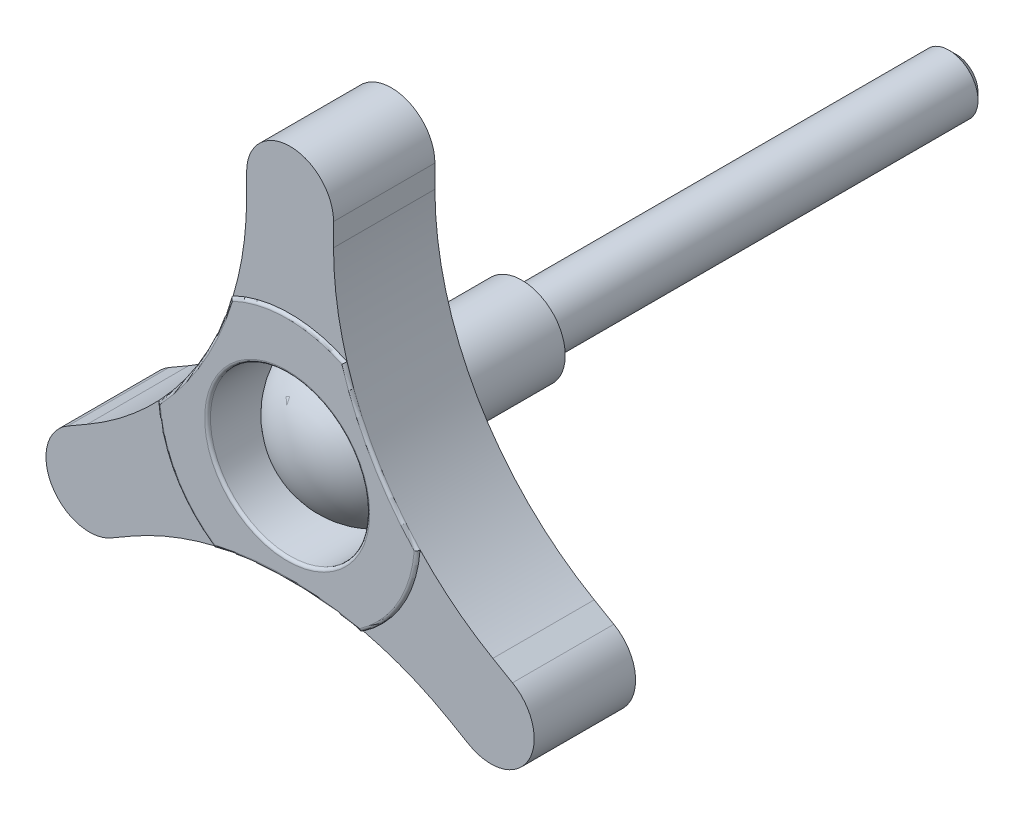
ISO-10303-21;
HEADER;
FILE_DESCRIPTION(('STEP AP214'),'2;1');
FILE_NAME('part.step','',(''),(''),'','','');
FILE_SCHEMA(('AUTOMOTIVE_DESIGN { 1 0 10303 214 1 1 1 1 }'));
ENDSEC;
DATA;
#1=APPLICATION_CONTEXT('core data for automotive mechanical design processes');
#2=APPLICATION_PROTOCOL_DEFINITION('international standard','automotive_design',2000,#1);
#3=PRODUCT_CONTEXT('',#1,'mechanical');
#4=PRODUCT('Part','Part','',(#3));
#5=PRODUCT_RELATED_PRODUCT_CATEGORY('part','',(#4));
#6=PRODUCT_DEFINITION_FORMATION('','',#4);
#7=PRODUCT_DEFINITION_CONTEXT('part definition',#1,'design');
#8=PRODUCT_DEFINITION('design','',#6,#7);
#9=PRODUCT_DEFINITION_SHAPE('','',#8);
#10=(LENGTH_UNIT() NAMED_UNIT(*) SI_UNIT(.MILLI.,.METRE.));
#11=(NAMED_UNIT(*) PLANE_ANGLE_UNIT() SI_UNIT($,.RADIAN.));
#12=(NAMED_UNIT(*) SI_UNIT($,.STERADIAN.) SOLID_ANGLE_UNIT());
#13=UNCERTAINTY_MEASURE_WITH_UNIT(LENGTH_MEASURE(1.E-05),#10,'distance_accuracy_value','');
#14=(GEOMETRIC_REPRESENTATION_CONTEXT(3) GLOBAL_UNCERTAINTY_ASSIGNED_CONTEXT((#13)) GLOBAL_UNIT_ASSIGNED_CONTEXT((#10,
#11,#12)) REPRESENTATION_CONTEXT('',''));
#15=CARTESIAN_POINT('',(0.,0.,0.));
#16=DIRECTION('',(0.,0.,1.));
#17=DIRECTION('',(1.,0.,0.));
#18=AXIS2_PLACEMENT_3D('',#15,#16,#17);
#19=CARTESIAN_POINT('',(-25.,14.4337567297406,7.));
#20=DIRECTION('',(0.,0.,-1.));
#21=DIRECTION('',(0.,1.,0.));
#22=AXIS2_PLACEMENT_3D('',#19,#20,#21);
#23=CYLINDRICAL_SURFACE('',#22,22.);
#24=CARTESIAN_POINT('',(-25.,14.4337567297406,7.00000000000001));
#25=DIRECTION('',(0.,0.,1.));
#26=DIRECTION('',(-1.,0.,0.));
#27=AXIS2_PLACEMENT_3D('',#24,#25,#26);
#28=CIRCLE('',#27,22.);
#29=CARTESIAN_POINT('',(-14.,-4.618802153517,7.00000000000001));
#30=VERTEX_POINT('',#29);
#31=CARTESIAN_POINT('',(-8.97710064562592,-0.641610472407324,7.));
#32=VERTEX_POINT('',#31);
#33=EDGE_CURVE('P0_E680',#30,#32,#28,.T.);
#34=ORIENTED_EDGE('',*,*,#33,.T.);
#35=CARTESIAN_POINT('',(-25.,14.4337567297406,7.));
#36=DIRECTION('',(0.,0.,1.));
#37=DIRECTION('',(1.,0.,0.));
#38=AXIS2_PLACEMENT_3D('',#35,#36,#37);
#39=CIRCLE('',#38,22.);
#40=CARTESIAN_POINT('',(-3.93289935437409,8.09520244764539,7.));
#41=VERTEX_POINT('',#40);
#42=EDGE_CURVE('P0_E701',#32,#41,#39,.T.);
#43=ORIENTED_EDGE('',*,*,#42,.T.);
#44=CARTESIAN_POINT('',(-3.,14.4337567297406,7.00000000000001));
#45=VERTEX_POINT('',#44);
#46=EDGE_CURVE('P0_E213',#41,#45,#28,.T.);
#47=ORIENTED_EDGE('',*,*,#46,.T.);
#48=DIRECTION('',(0.,0.,1.));
#49=VECTOR('',#48,1.);
#50=CARTESIAN_POINT('',(-3.,14.4337567297406,0.));
#51=LINE('',#50,#49);
#52=CARTESIAN_POINT('',(-3.,14.4337567297406,0.));
#53=VERTEX_POINT('',#52);
#54=EDGE_CURVE('P0_E193',#53,#45,#51,.T.);
#55=ORIENTED_EDGE('',*,*,#54,.F.);
#56=CARTESIAN_POINT('',(-25.,14.4337567297406,0.));
#57=DIRECTION('',(0.,0.,1.));
#58=DIRECTION('',(-1.,0.,0.));
#59=AXIS2_PLACEMENT_3D('',#56,#57,#58);
#60=CIRCLE('',#59,22.);
#61=CARTESIAN_POINT('',(-14.,-4.618802153517,0.));
#62=VERTEX_POINT('',#61);
#63=EDGE_CURVE('P0_E199',#62,#53,#60,.T.);
#64=ORIENTED_EDGE('',*,*,#63,.F.);
#65=DIRECTION('',(0.,0.,1.));
#66=VECTOR('',#65,1.);
#67=CARTESIAN_POINT('',(-14.,-4.618802153517,0.));
#68=LINE('',#67,#66);
#69=EDGE_CURVE('P0_E404',#62,#30,#68,.T.);
#70=ORIENTED_EDGE('',*,*,#69,.T.);
#71=EDGE_LOOP('',(#34,#43,#47,#55,#64,#70));
#72=FACE_BOUND('',#71,.T.);
#73=ADVANCED_FACE('P0_F63',(#72),#23,.F.);
#74=CARTESIAN_POINT('',(0.,-28.8675134594813,7.));
#75=DIRECTION('',(0.,0.,-1.));
#76=DIRECTION('',(0.,1.,0.));
#77=AXIS2_PLACEMENT_3D('',#74,#75,#76);
#78=CYLINDRICAL_SURFACE('',#77,22.);
#79=CARTESIAN_POINT('',(0.,-28.8675134594813,7.00000000000001));
#80=DIRECTION('',(0.,0.,1.));
#81=DIRECTION('',(-1.,0.,0.));
#82=AXIS2_PLACEMENT_3D('',#79,#80,#81);
#83=CIRCLE('',#82,22.);
#84=CARTESIAN_POINT('',(11.,-9.81495457622364,7.00000000000001));
#85=VERTEX_POINT('',#84);
#86=CARTESIAN_POINT('',(5.04420129125183,-7.45359197523808,7.));
#87=VERTEX_POINT('',#86);
#88=EDGE_CURVE('P0_E378',#85,#87,#83,.T.);
#89=ORIENTED_EDGE('',*,*,#88,.T.);
#90=CARTESIAN_POINT('',(0.,-28.8675134594813,7.));
#91=DIRECTION('',(0.,0.,1.));
#92=DIRECTION('',(1.,0.,0.));
#93=AXIS2_PLACEMENT_3D('',#90,#91,#92);
#94=CIRCLE('',#93,22.);
#95=CARTESIAN_POINT('',(-5.04420129125182,-7.45359197523807,7.00000000000001));
#96=VERTEX_POINT('',#95);
#97=EDGE_CURVE('P0_E71',#87,#96,#94,.T.);
#98=ORIENTED_EDGE('',*,*,#97,.T.);
#99=CARTESIAN_POINT('',(-11.,-9.81495457622364,7.00000000000001));
#100=VERTEX_POINT('',#99);
#101=EDGE_CURVE('P0_E374',#96,#100,#83,.T.);
#102=ORIENTED_EDGE('',*,*,#101,.T.);
#103=DIRECTION('',(0.,0.,1.));
#104=VECTOR('',#103,1.);
#105=CARTESIAN_POINT('',(-11.,-9.81495457622364,0.));
#106=LINE('',#105,#104);
#107=CARTESIAN_POINT('',(-11.,-9.81495457622364,0.));
#108=VERTEX_POINT('',#107);
#109=EDGE_CURVE('P0_E412',#108,#100,#106,.T.);
#110=ORIENTED_EDGE('',*,*,#109,.F.);
#111=CARTESIAN_POINT('',(0.,-28.8675134594813,0.));
#112=DIRECTION('',(0.,0.,1.));
#113=DIRECTION('',(-1.,0.,0.));
#114=AXIS2_PLACEMENT_3D('',#111,#112,#113);
#115=CIRCLE('',#114,22.);
#116=CARTESIAN_POINT('',(11.,-9.81495457622364,0.));
#117=VERTEX_POINT('',#116);
#118=EDGE_CURVE('P0_E673',#117,#108,#115,.T.);
#119=ORIENTED_EDGE('',*,*,#118,.F.);
#120=DIRECTION('',(0.,0.,1.));
#121=VECTOR('',#120,1.);
#122=CARTESIAN_POINT('',(11.,-9.81495457622364,0.));
#123=LINE('',#122,#121);
#124=EDGE_CURVE('P0_E414',#117,#85,#123,.T.);
#125=ORIENTED_EDGE('',*,*,#124,.T.);
#126=EDGE_LOOP('',(#89,#98,#102,#110,#119,#125));
#127=FACE_BOUND('',#126,.T.);
#128=ADVANCED_FACE('P0_F371',(#127),#78,.F.);
#129=CARTESIAN_POINT('',(25.,14.4337567297406,7.));
#130=DIRECTION('',(0.,0.,-1.));
#131=DIRECTION('',(0.,1.,0.));
#132=AXIS2_PLACEMENT_3D('',#129,#130,#131);
#133=CYLINDRICAL_SURFACE('',#132,22.);
#134=CARTESIAN_POINT('',(25.,14.4337567297406,7.00000000000001));
#135=DIRECTION('',(0.,0.,1.));
#136=DIRECTION('',(-1.,0.,0.));
#137=AXIS2_PLACEMENT_3D('',#134,#135,#136);
#138=CIRCLE('',#137,22.);
#139=CARTESIAN_POINT('',(3.,14.4337567297406,7.00000000000001));
#140=VERTEX_POINT('',#139);
#141=CARTESIAN_POINT('',(3.93289935437409,8.09520244764539,7.));
#142=VERTEX_POINT('',#141);
#143=EDGE_CURVE('P0_E444',#140,#142,#138,.T.);
#144=ORIENTED_EDGE('',*,*,#143,.T.);
#145=CARTESIAN_POINT('',(25.,14.4337567297406,7.));
#146=DIRECTION('',(0.,0.,1.));
#147=DIRECTION('',(1.,0.,0.));
#148=AXIS2_PLACEMENT_3D('',#145,#146,#147);
#149=CIRCLE('',#148,22.);
#150=CARTESIAN_POINT('',(8.97710064562592,-0.641610472407324,7.));
#151=VERTEX_POINT('',#150);
#152=EDGE_CURVE('P0_E571',#142,#151,#149,.T.);
#153=ORIENTED_EDGE('',*,*,#152,.T.);
#154=CARTESIAN_POINT('',(14.,-4.61880215351701,7.00000000000001));
#155=VERTEX_POINT('',#154);
#156=EDGE_CURVE('P0_E445',#151,#155,#138,.T.);
#157=ORIENTED_EDGE('',*,*,#156,.T.);
#158=DIRECTION('',(0.,0.,1.));
#159=VECTOR('',#158,1.);
#160=CARTESIAN_POINT('',(14.,-4.61880215351701,0.));
#161=LINE('',#160,#159);
#162=CARTESIAN_POINT('',(14.,-4.61880215351701,0.));
#163=VERTEX_POINT('',#162);
#164=EDGE_CURVE('P0_E422',#163,#155,#161,.T.);
#165=ORIENTED_EDGE('',*,*,#164,.F.);
#166=CARTESIAN_POINT('',(25.,14.4337567297406,0.));
#167=DIRECTION('',(0.,0.,1.));
#168=DIRECTION('',(-1.,0.,0.));
#169=AXIS2_PLACEMENT_3D('',#166,#167,#168);
#170=CIRCLE('',#169,22.);
#171=CARTESIAN_POINT('',(3.,14.4337567297406,0.));
#172=VERTEX_POINT('',#171);
#173=EDGE_CURVE('P0_E666',#172,#163,#170,.T.);
#174=ORIENTED_EDGE('',*,*,#173,.F.);
#175=DIRECTION('',(0.,0.,1.));
#176=VECTOR('',#175,1.);
#177=CARTESIAN_POINT('',(3.,14.4337567297406,0.));
#178=LINE('',#177,#176);
#179=EDGE_CURVE('P0_E425',#172,#140,#178,.T.);
#180=ORIENTED_EDGE('',*,*,#179,.T.);
#181=EDGE_LOOP('',(#144,#153,#157,#165,#174,#180));
#182=FACE_BOUND('',#181,.T.);
#183=ADVANCED_FACE('P0_F282',(#182),#133,.F.);
#184=CARTESIAN_POINT('',(0.,4.,7.2));
#185=DIRECTION('',(0.,0.,1.));
#186=DIRECTION('',(1.,0.,0.));
#187=AXIS2_PLACEMENT_3D('',#184,#185,#186);
#188=PLANE('',#187);
#189=CARTESIAN_POINT('',(0.,0.,7.2));
#190=DIRECTION('',(0.,0.,1.));
#191=DIRECTION('',(1.,0.,0.));
#192=AXIS2_PLACEMENT_3D('',#189,#190,#191);
#193=CIRCLE('',#192,5.7);
#194=CARTESIAN_POINT('',(5.7,0.,7.2));
#195=VERTEX_POINT('',#194);
#196=EDGE_CURVE('P0_E708',#195,#195,#193,.F.);
#197=ORIENTED_EDGE('',*,*,#196,.T.);
#198=EDGE_LOOP('',(#197));
#199=FACE_BOUND('',#198,.T.);
#200=CARTESIAN_POINT('',(0.,0.,7.2));
#201=DIRECTION('',(0.,0.,1.));
#202=DIRECTION('',(0.,-1.,0.));
#203=AXIS2_PLACEMENT_3D('',#200,#201,#202);
#204=CIRCLE('',#203,8.8);
#205=CARTESIAN_POINT('',(5.00395030617477,-7.23881767509954,7.2));
#206=VERTEX_POINT('',#205);
#207=CARTESIAN_POINT('',(8.77097515308739,-0.714139246872517,7.2));
#208=VERTEX_POINT('',#207);
#209=EDGE_CURVE('P0_E218',#206,#208,#204,.T.);
#210=ORIENTED_EDGE('',*,*,#209,.T.);
#211=CARTESIAN_POINT('',(25.,14.4337567297406,7.2));
#212=DIRECTION('',(0.,0.,1.));
#213=DIRECTION('',(1.,0.,0.));
#214=AXIS2_PLACEMENT_3D('',#211,#212,#213);
#215=CIRCLE('',#214,22.2);
#216=CARTESIAN_POINT('',(3.76702484691261,7.95295692197204,7.2));
#217=VERTEX_POINT('',#216);
#218=EDGE_CURVE('P0_E338',#208,#217,#215,.F.);
#219=ORIENTED_EDGE('',*,*,#218,.T.);
#220=CARTESIAN_POINT('',(0.,0.,7.2));
#221=DIRECTION('',(0.,0.,1.));
#222=DIRECTION('',(0.,-1.,0.));
#223=AXIS2_PLACEMENT_3D('',#220,#221,#222);
#224=CIRCLE('',#223,8.8);
#225=CARTESIAN_POINT('',(-3.76702484691261,7.95295692197204,7.2));
#226=VERTEX_POINT('',#225);
#227=EDGE_CURVE('P0_E215',#217,#226,#224,.T.);
#228=ORIENTED_EDGE('',*,*,#227,.T.);
#229=CARTESIAN_POINT('',(-25.,14.4337567297406,7.2));
#230=DIRECTION('',(0.,0.,1.));
#231=DIRECTION('',(1.,0.,0.));
#232=AXIS2_PLACEMENT_3D('',#229,#230,#231);
#233=CIRCLE('',#232,22.2);
#234=CARTESIAN_POINT('',(-8.77097515308739,-0.71413924687251,7.2));
#235=VERTEX_POINT('',#234);
#236=EDGE_CURVE('P0_E85',#226,#235,#233,.F.);
#237=ORIENTED_EDGE('',*,*,#236,.T.);
#238=CARTESIAN_POINT('',(0.,0.,7.2));
#239=DIRECTION('',(0.,0.,1.));
#240=DIRECTION('',(0.,-1.,0.));
#241=AXIS2_PLACEMENT_3D('',#238,#239,#240);
#242=CIRCLE('',#241,8.8);
#243=CARTESIAN_POINT('',(-5.00395030617475,-7.23881767509954,7.2));
#244=VERTEX_POINT('',#243);
#245=EDGE_CURVE('P0_E474',#235,#244,#242,.T.);
#246=ORIENTED_EDGE('',*,*,#245,.T.);
#247=CARTESIAN_POINT('',(0.,-28.8675134594813,7.2));
#248=DIRECTION('',(0.,0.,1.));
#249=DIRECTION('',(1.,0.,0.));
#250=AXIS2_PLACEMENT_3D('',#247,#248,#249);
#251=CIRCLE('',#250,22.2);
#252=EDGE_CURVE('P0_E710',#244,#206,#251,.F.);
#253=ORIENTED_EDGE('',*,*,#252,.T.);
#254=EDGE_LOOP('',(#210,#219,#228,#237,#246,#253));
#255=FACE_BOUND('',#254,.T.);
#256=ADVANCED_FACE('P0_F293',(#199,#255),#188,.T.);
#257=CARTESIAN_POINT('',(0.,0.,7.));
#258=DIRECTION('',(0.,0.,1.));
#259=DIRECTION('',(0.,-1.,0.));
#260=AXIS2_PLACEMENT_3D('',#257,#258,#259);
#261=TOROIDAL_SURFACE('',#260,8.8,0.2);
#262=ORIENTED_EDGE('',*,*,#245,.F.);
#263=CARTESIAN_POINT('',(-8.97710064562592,-0.641610472407322,7.));
#264=CARTESIAN_POINT('',(-8.97711309520333,-0.641605882757259,7.01057111484391));
#265=CARTESIAN_POINT('',(-8.97623934670984,-0.64191688450356,7.0211339227335));
#266=CARTESIAN_POINT('',(-8.97281758216533,-0.643133952924289,7.04191805200999));
#267=CARTESIAN_POINT('',(-8.97027461495959,-0.644038225143787,7.05214030580011));
#268=CARTESIAN_POINT('',(-8.96361264114699,-0.646405695216601,7.07198218829785));
#269=CARTESIAN_POINT('',(-8.95949418216358,-0.647868698860784,7.08160202504843));
#270=CARTESIAN_POINT('',(-8.9498420844149,-0.65129435737187,7.10000753737208));
#271=CARTESIAN_POINT('',(-8.94430783248271,-0.653257228725211,7.1087928492537));
#272=CARTESIAN_POINT('',(-8.93180389220912,-0.657687262301016,7.12561861464266));
#273=CARTESIAN_POINT('',(-8.92479169748425,-0.66016933604479,7.1336234613601));
#274=CARTESIAN_POINT('',(-8.90968154601406,-0.665510816081923,7.14838360085125));
#275=CARTESIAN_POINT('',(-8.90158322548768,-0.668370348794243,7.15513847315359));
#276=CARTESIAN_POINT('',(-8.88384568944188,-0.674624422001042,7.16777836650868));
#277=CARTESIAN_POINT('',(-8.87413508266933,-0.678043445947619,7.17355097176247));
#278=CARTESIAN_POINT('',(-8.85398281672779,-0.685126838621748,7.18343340527859));
#279=CARTESIAN_POINT('',(-8.84354089138323,-0.6887912966577,7.18754262439577));
#280=CARTESIAN_POINT('',(-8.82331588667812,-0.695876371215308,7.19370722955295));
#281=CARTESIAN_POINT('',(-8.81357870576799,-0.699282205849993,7.19593292901901));
#282=CARTESIAN_POINT('',(-8.79392138061766,-0.706146669463738,7.19899433589209));
#283=CARTESIAN_POINT('',(-8.78400162015848,-0.709605185539782,7.19983268252522));
#284=CARTESIAN_POINT('',(-8.77304613904866,-0.713418564085811,7.19999247264395));
#285=CARTESIAN_POINT('',(-8.77201058996737,-0.713778955929756,7.20000001743494));
#286=CARTESIAN_POINT('',(-8.77097515308739,-0.714139246872506,7.2));
#287=B_SPLINE_CURVE_WITH_KNOTS('',3,(#263,#264,#265,#266,#267,#268,#269,#270,#271,#272,#273,
#274,#275,#276,#277,#278,#279,#280,#281,#282,#283,#284,#285,#286),.UNSPECIFIED.,.F.,.F.,(4,2,2,
2,2,2,2,2,2,2,2,4),(0.,0.0316598202416981,0.0632243183413231,0.0947778549261602,
0.126345080261375,0.158988547646052,0.191642975887965,0.22690299904641,0.262175923047602,
0.293746223805065,0.325256397573742,0.3285457614145),.UNSPECIFIED.);
#288=EDGE_CURVE('P0_E357',#235,#32,#287,.F.);
#289=ORIENTED_EDGE('',*,*,#288,.T.);
#290=CARTESIAN_POINT('',(0.,0.,7.));
#291=DIRECTION('',(0.,0.,1.));
#292=DIRECTION('',(0.,-1.,0.));
#293=AXIS2_PLACEMENT_3D('',#290,#291,#292);
#294=CIRCLE('',#293,9.);
#295=EDGE_CURVE('P0_E382',#32,#96,#294,.T.);
#296=ORIENTED_EDGE('',*,*,#295,.T.);
#297=CARTESIAN_POINT('',(-5.04420129125182,-7.45359197523808,7.));
#298=CARTESIAN_POINT('',(-5.04420354128697,-7.45360505171342,7.01057111484391));
#299=CARTESIAN_POINT('',(-5.04403600245314,-7.45269286244839,7.0211339227335));
#300=CARTESIAN_POINT('',(-5.04337913235138,-7.44912099321671,7.04191805200999));
#301=CARTESIAN_POINT('',(-5.04289077146253,-7.4464665829058,7.05214030580011));
#302=CARTESIAN_POINT('',(-5.04161007378199,-7.43951340930834,7.07198218829785));
#303=CARTESIAN_POINT('',(-5.04081784261198,-7.43521521738216,7.08160202504843));
#304=CARTESIAN_POINT('',(-5.03895850103294,-7.42514342627646,7.10000753737208));
#305=CARTESIAN_POINT('',(-5.03789127152319,-7.41936918783557,7.10879284925369));
#306=CARTESIAN_POINT('',(-5.03547582300267,-7.40632544112333,7.12561861464266));
#307=CARTESIAN_POINT('',(-5.0341192645564,-7.39901166548342,7.1336234613601));
#308=CARTESIAN_POINT('',(-5.03119004622727,-7.38325515043664,7.14838360085124));
#309=CARTESIAN_POINT('',(-5.0296173139359,-7.37481203277664,7.15513847315359));
#310=CARTESIAN_POINT('',(-5.02616473218722,-7.35632383935704,7.16777836650868));
#311=CARTESIAN_POINT('',(-5.02427039039483,-7.34620469523256,7.17355097176246));
#312=CARTESIAN_POINT('',(-5.02032865542483,-7.3252106246463,7.18343340527859));
#313=CARTESIAN_POINT('',(-5.01828120650278,-7.31433542301552,7.18754262439577));
#314=CARTESIAN_POINT('',(-5.01430455870483,-7.29327751787043,7.19370722955295));
#315=CARTESIAN_POINT('',(-5.0123855075645,-7.28314195452366,7.19593292901902));
#316=CARTESIAN_POINT('',(-5.00850164486218,-7.26268597976616,7.1989943358921));
#317=CARTESIAN_POINT('',(-5.00653692741381,-7.25236595717103,7.19983268252522));
#318=CARTESIAN_POINT('',(-5.00436166955404,-7.24097154294623,7.19999247264395));
#319=CARTESIAN_POINT('',(-5.00415600350557,-7.23989453521299,7.20000001743494));
#320=CARTESIAN_POINT('',(-5.00395030617475,-7.23881767509954,7.2));
#321=B_SPLINE_CURVE_WITH_KNOTS('',3,(#297,#298,#299,#300,#301,#302,#303,#304,#305,#306,#307,
#308,#309,#310,#311,#312,#313,#314,#315,#316,#317,#318,#319,#320),.UNSPECIFIED.,.F.,.F.,(4,2,2,
2,2,2,2,2,2,2,2,4),(0.,0.0316598202416974,0.0632243183413227,0.0947778549261586,
0.126345080261373,0.15898854764605,0.191642975887965,0.226902999046409,0.262175923047602,
0.293746223805066,0.325256397573747,0.328545761414504),.UNSPECIFIED.);
#322=EDGE_CURVE('P0_E78',#96,#244,#321,.T.);
#323=ORIENTED_EDGE('',*,*,#322,.T.);
#324=EDGE_LOOP('',(#262,#289,#296,#323));
#325=FACE_BOUND('',#324,.T.);
#326=ADVANCED_FACE('P0_F289',(#325),#261,.T.);
#327=CARTESIAN_POINT('',(0.,0.,7.));
#328=DIRECTION('',(0.,0.,1.));
#329=DIRECTION('',(0.,-1.,0.));
#330=AXIS2_PLACEMENT_3D('',#327,#328,#329);
#331=TOROIDAL_SURFACE('',#330,8.8,0.2);
#332=ORIENTED_EDGE('',*,*,#227,.F.);
#333=CARTESIAN_POINT('',(3.93289935437409,8.09520244764539,7.));
#334=CARTESIAN_POINT('',(3.93290955391634,8.09521093447066,7.01057111484391));
#335=CARTESIAN_POINT('',(3.93220334425667,8.09460974695194,7.0211339227335));
#336=CARTESIAN_POINT('',(3.92943844981392,8.09225494614099,7.04191805200999));
#337=CARTESIAN_POINT('',(3.92738384349704,8.09050480804958,7.0521403058001));
#338=CARTESIAN_POINT('',(3.92200256736498,8.08591910452493,7.07198218829785));
#339=CARTESIAN_POINT('',(3.91867633955158,8.08308391624294,7.08160202504843));
#340=CARTESIAN_POINT('',(3.91088358338195,8.07643778364832,7.10000753737208));
#341=CARTESIAN_POINT('',(3.9064165609595,8.07262641656077,7.1087928492537));
#342=CARTESIAN_POINT('',(3.89632806920645,8.06401270342434,7.12561861464266));
#343=CARTESIAN_POINT('',(3.89067243292784,8.05918100152821,7.1336234613601));
#344=CARTESIAN_POINT('',(3.87849149978677,8.04876596651855,7.14838360085124));
#345=CARTESIAN_POINT('',(3.87196591155176,8.04318238157088,7.15513847315359));
#346=CARTESIAN_POINT('',(3.85768095725464,8.03094826135808,7.16777836650868));
#347=CARTESIAN_POINT('',(3.84986469227448,8.02424814118018,7.17355097176246));
#348=CARTESIAN_POINT('',(3.83365416130294,8.01033746326805,7.18343340527858));
#349=CARTESIAN_POINT('',(3.82525968488043,8.00312671967321,7.18754262439577));
#350=CARTESIAN_POINT('',(3.80901132797327,7.98915388908572,7.19370722955295));
#351=CARTESIAN_POINT('',(3.80119319820348,7.98242416037366,7.19593292901902));
#352=CARTESIAN_POINT('',(3.78541973575546,7.96883264922989,7.1989943358921));
#353=CARTESIAN_POINT('',(3.77746469274463,7.96197114271079,7.19983268252522));
#354=CARTESIAN_POINT('',(3.7686844694946,7.95439010703203,7.19999247264395));
#355=CARTESIAN_POINT('',(3.76785458646178,7.95367349114274,7.20000001743494));
#356=CARTESIAN_POINT('',(3.76702484691261,7.95295692197204,7.2));
#357=B_SPLINE_CURVE_WITH_KNOTS('',3,(#333,#334,#335,#336,#337,#338,#339,#340,#341,#342,#343,
#344,#345,#346,#347,#348,#349,#350,#351,#352,#353,#354,#355,#356),.UNSPECIFIED.,.F.,.F.,(4,2,2,
2,2,2,2,2,2,2,2,4),(0.,0.0316598202416963,0.063224318341322,0.0947778549261596,
0.126345080261372,0.158988547646048,0.191642975887962,0.226902999046407,0.262175923047601,
0.293746223805066,0.325256397573749,0.328545761414504),.UNSPECIFIED.);
#358=EDGE_CURVE('P0_E337',#217,#142,#357,.F.);
#359=ORIENTED_EDGE('',*,*,#358,.T.);
#360=CARTESIAN_POINT('',(0.,0.,7.));
#361=DIRECTION('',(0.,0.,1.));
#362=DIRECTION('',(0.,-1.,0.));
#363=AXIS2_PLACEMENT_3D('',#360,#361,#362);
#364=CIRCLE('',#363,9.);
#365=EDGE_CURVE('P0_E388',#142,#41,#364,.T.);
#366=ORIENTED_EDGE('',*,*,#365,.T.);
#367=CARTESIAN_POINT('',(-3.93289935437409,8.09520244764539,7.));
#368=CARTESIAN_POINT('',(-3.93290955391634,8.09521093447066,7.01057111484391));
#369=CARTESIAN_POINT('',(-3.93220334425667,8.09460974695194,7.0211339227335));
#370=CARTESIAN_POINT('',(-3.92943844981392,8.09225494614099,7.04191805200999));
#371=CARTESIAN_POINT('',(-3.92738384349704,8.09050480804958,7.0521403058001));
#372=CARTESIAN_POINT('',(-3.92200256736498,8.08591910452493,7.07198218829785));
#373=CARTESIAN_POINT('',(-3.91867633955158,8.08308391624294,7.08160202504843));
#374=CARTESIAN_POINT('',(-3.91088358338195,8.07643778364832,7.10000753737208));
#375=CARTESIAN_POINT('',(-3.9064165609595,8.07262641656077,7.1087928492537));
#376=CARTESIAN_POINT('',(-3.89632806920645,8.06401270342434,7.12561861464266));
#377=CARTESIAN_POINT('',(-3.89067243292784,8.05918100152821,7.1336234613601));
#378=CARTESIAN_POINT('',(-3.87849149978677,8.04876596651855,7.14838360085124));
#379=CARTESIAN_POINT('',(-3.87196591155176,8.04318238157088,7.15513847315359));
#380=CARTESIAN_POINT('',(-3.85768095725464,8.03094826135808,7.16777836650868));
#381=CARTESIAN_POINT('',(-3.84986469227448,8.02424814118018,7.17355097176246));
#382=CARTESIAN_POINT('',(-3.83365416130294,8.01033746326805,7.18343340527858));
#383=CARTESIAN_POINT('',(-3.82525968488043,8.00312671967321,7.18754262439577));
#384=CARTESIAN_POINT('',(-3.80901132797327,7.98915388908572,7.19370722955295));
#385=CARTESIAN_POINT('',(-3.80119319820348,7.98242416037366,7.19593292901902));
#386=CARTESIAN_POINT('',(-3.78541973575546,7.96883264922989,7.1989943358921));
#387=CARTESIAN_POINT('',(-3.77746469274463,7.96197114271079,7.19983268252522));
#388=CARTESIAN_POINT('',(-3.7686844694946,7.95439010703203,7.19999247264395));
#389=CARTESIAN_POINT('',(-3.76785458646178,7.95367349114274,7.20000001743494));
#390=CARTESIAN_POINT('',(-3.76702484691261,7.95295692197204,7.2));
#391=B_SPLINE_CURVE_WITH_KNOTS('',3,(#367,#368,#369,#370,#371,#372,#373,#374,#375,#376,#377,
#378,#379,#380,#381,#382,#383,#384,#385,#386,#387,#388,#389,#390),.UNSPECIFIED.,.F.,.F.,(4,2,2,
2,2,2,2,2,2,2,2,4),(0.,0.0316598202416963,0.063224318341322,0.0947778549261596,
0.126345080261372,0.158988547646048,0.191642975887962,0.226902999046407,0.262175923047601,
0.293746223805066,0.325256397573749,0.328545761414504),.UNSPECIFIED.);
#392=EDGE_CURVE('P0_E330',#41,#226,#391,.T.);
#393=ORIENTED_EDGE('',*,*,#392,.T.);
#394=EDGE_LOOP('',(#332,#359,#366,#393));
#395=FACE_BOUND('',#394,.T.);
#396=ADVANCED_FACE('P0_F285',(#395),#331,.T.);
#397=CARTESIAN_POINT('',(0.,0.,7.));
#398=DIRECTION('',(0.,0.,1.));
#399=DIRECTION('',(0.,-1.,0.));
#400=AXIS2_PLACEMENT_3D('',#397,#398,#399);
#401=TOROIDAL_SURFACE('',#400,8.8,0.2);
#402=CARTESIAN_POINT('',(0.,0.,7.));
#403=DIRECTION('',(0.,0.,1.));
#404=DIRECTION('',(0.,-1.,0.));
#405=AXIS2_PLACEMENT_3D('',#402,#403,#404);
#406=CIRCLE('',#405,9.);
#407=EDGE_CURVE('P0_E471',#87,#151,#406,.T.);
#408=ORIENTED_EDGE('',*,*,#407,.T.);
#409=CARTESIAN_POINT('',(8.97710064562592,-0.641610472407326,7.));
#410=CARTESIAN_POINT('',(8.97711309520333,-0.641605882757265,7.01057111484391));
#411=CARTESIAN_POINT('',(8.97623934670984,-0.641916884503565,7.0211339227335));
#412=CARTESIAN_POINT('',(8.97281758216533,-0.643133952924294,7.04191805200999));
#413=CARTESIAN_POINT('',(8.9702746149596,-0.64403822514379,7.05214030580011));
#414=CARTESIAN_POINT('',(8.963612641147,-0.646405695216604,7.07198218829785));
#415=CARTESIAN_POINT('',(8.95949418216358,-0.647868698860787,7.08160202504843));
#416=CARTESIAN_POINT('',(8.94984208441491,-0.651294357371874,7.10000753737208));
#417=CARTESIAN_POINT('',(8.94430783248272,-0.653257228725215,7.1087928492537));
#418=CARTESIAN_POINT('',(8.93180389220913,-0.65768726230102,7.12561861464266));
#419=CARTESIAN_POINT('',(8.92479169748426,-0.660169336044795,7.1336234613601));
#420=CARTESIAN_POINT('',(8.90968154601406,-0.665510816081929,7.14838360085124));
#421=CARTESIAN_POINT('',(8.90158322548769,-0.66837034879425,7.15513847315359));
#422=CARTESIAN_POINT('',(8.88384568944188,-0.67462442200105,7.16777836650868));
#423=CARTESIAN_POINT('',(8.87413508266933,-0.678043445947625,7.17355097176246));
#424=CARTESIAN_POINT('',(8.85398281672779,-0.685126838621752,7.18343340527859));
#425=CARTESIAN_POINT('',(8.84354089138324,-0.688791296657703,7.18754262439577));
#426=CARTESIAN_POINT('',(8.82331588667812,-0.695876371215315,7.19370722955295));
#427=CARTESIAN_POINT('',(8.81357870576799,-0.699282205850005,7.19593292901902));
#428=CARTESIAN_POINT('',(8.79392138061767,-0.70614666946374,7.1989943358921));
#429=CARTESIAN_POINT('',(8.78400162015847,-0.709605185539771,7.19983268252522));
#430=CARTESIAN_POINT('',(8.77304613904866,-0.713418564085816,7.19999247264395));
#431=CARTESIAN_POINT('',(8.77201058996737,-0.713778955929763,7.20000001743494));
#432=CARTESIAN_POINT('',(8.77097515308739,-0.714139246872515,7.2));
#433=B_SPLINE_CURVE_WITH_KNOTS('',3,(#409,#410,#411,#412,#413,#414,#415,#416,#417,#418,#419,
#420,#421,#422,#423,#424,#425,#426,#427,#428,#429,#430,#431,#432),.UNSPECIFIED.,.F.,.F.,(4,2,2,
2,2,2,2,2,2,2,2,4),(0.,0.0316598202416979,0.0632243183413226,0.0947778549261598,
0.126345080261373,0.158988547646051,0.191642975887965,0.226902999046409,0.262175923047601,
0.293746223805065,0.325256397573747,0.328545761414504),.UNSPECIFIED.);
#434=EDGE_CURVE('P0_E580',#151,#208,#433,.T.);
#435=ORIENTED_EDGE('',*,*,#434,.T.);
#436=ORIENTED_EDGE('',*,*,#209,.F.);
#437=CARTESIAN_POINT('',(5.04420129125183,-7.45359197523808,7.));
#438=CARTESIAN_POINT('',(5.04420354128698,-7.45360505171341,7.01057111484391));
#439=CARTESIAN_POINT('',(5.04403600245316,-7.45269286244838,7.0211339227335));
#440=CARTESIAN_POINT('',(5.04337913235139,-7.4491209932167,7.04191805200999));
#441=CARTESIAN_POINT('',(5.04289077146255,-7.4464665829058,7.05214030580011));
#442=CARTESIAN_POINT('',(5.041610073782,-7.43951340930833,7.07198218829785));
#443=CARTESIAN_POINT('',(5.04081784261199,-7.43521521738216,7.08160202504843));
#444=CARTESIAN_POINT('',(5.03895850103295,-7.42514342627645,7.10000753737208));
#445=CARTESIAN_POINT('',(5.03789127152321,-7.41936918783556,7.1087928492537));
#446=CARTESIAN_POINT('',(5.03547582300268,-7.40632544112333,7.12561861464266));
#447=CARTESIAN_POINT('',(5.03411926455641,-7.39901166548342,7.1336234613601));
#448=CARTESIAN_POINT('',(5.03119004622728,-7.38325515043663,7.14838360085124));
#449=CARTESIAN_POINT('',(5.02961731393592,-7.37481203277664,7.15513847315359));
#450=CARTESIAN_POINT('',(5.02616473218724,-7.35632383935703,7.16777836650868));
#451=CARTESIAN_POINT('',(5.02427039039484,-7.34620469523256,7.17355097176246));
#452=CARTESIAN_POINT('',(5.02032865542484,-7.3252106246463,7.18343340527859));
#453=CARTESIAN_POINT('',(5.0182812065028,-7.31433542301552,7.18754262439577));
#454=CARTESIAN_POINT('',(5.01430455870484,-7.29327751787042,7.19370722955295));
#455=CARTESIAN_POINT('',(5.0123855075645,-7.28314195452366,7.19593292901902));
#456=CARTESIAN_POINT('',(5.00850164486219,-7.26268597976616,7.1989943358921));
#457=CARTESIAN_POINT('',(5.00653692741384,-7.25236595717103,7.19983268252522));
#458=CARTESIAN_POINT('',(5.00436166955405,-7.24097154294622,7.19999247264395));
#459=CARTESIAN_POINT('',(5.00415600350558,-7.23989453521299,7.20000001743494));
#460=CARTESIAN_POINT('',(5.00395030617477,-7.23881767509954,7.2));
#461=B_SPLINE_CURVE_WITH_KNOTS('',3,(#437,#438,#439,#440,#441,#442,#443,#444,#445,#446,#447,
#448,#449,#450,#451,#452,#453,#454,#455,#456,#457,#458,#459,#460),.UNSPECIFIED.,.F.,.F.,(4,2,2,
2,2,2,2,2,2,2,2,4),(0.,0.0316598202416981,0.0632243183413233,0.094777854926161,
0.126345080261374,0.15898854764605,0.191642975887966,0.226902999046409,0.262175923047602,
0.293746223805068,0.325256397573749,0.328545761414507),.UNSPECIFIED.);
#462=EDGE_CURVE('P0_E574',#206,#87,#461,.F.);
#463=ORIENTED_EDGE('',*,*,#462,.T.);
#464=EDGE_LOOP('',(#408,#435,#436,#463));
#465=FACE_BOUND('',#464,.T.);
#466=ADVANCED_FACE('P0_F288',(#465),#401,.T.);
#467=CARTESIAN_POINT('',(-25.,14.4337567297406,7.00000000000001));
#468=DIRECTION('',(0.,0.,-1.));
#469=DIRECTION('',(-1.,0.,0.));
#470=AXIS2_PLACEMENT_3D('',#467,#468,#469);
#471=PLANE('',#470);
#472=ORIENTED_EDGE('',*,*,#295,.F.);
#473=ORIENTED_EDGE('',*,*,#33,.F.);
#474=DIRECTION('',(0.866025403784435,0.500000000000006,0.));
#475=VECTOR('',#474,1.);
#476=CARTESIAN_POINT('',(-14.,-4.618802153517,7.00000000000001));
#477=LINE('',#476,#475);
#478=CARTESIAN_POINT('',(-15.356406460551,-5.40192378864668,7.00000000000001));
#479=VERTEX_POINT('',#478);
#480=EDGE_CURVE('P0_E208',#479,#30,#477,.T.);
#481=ORIENTED_EDGE('',*,*,#480,.F.);
#482=CARTESIAN_POINT('',(-13.856406460551,-8.,7.00000000000001));
#483=DIRECTION('',(0.,0.,-1.));
#484=DIRECTION('',(1.,0.,0.));
#485=AXIS2_PLACEMENT_3D('',#482,#483,#484);
#486=CIRCLE('',#485,2.99999999999999);
#487=CARTESIAN_POINT('',(-12.356406460551,-10.5980762113533,7.00000000000001));
#488=VERTEX_POINT('',#487);
#489=EDGE_CURVE('P0_E401',#488,#479,#486,.T.);
#490=ORIENTED_EDGE('',*,*,#489,.F.);
#491=DIRECTION('',(-0.866025403784441,-0.499999999999996,0.));
#492=VECTOR('',#491,1.);
#493=CARTESIAN_POINT('',(-12.356406460551,-10.5980762113533,7.00000000000001));
#494=LINE('',#493,#492);
#495=EDGE_CURVE('P0_E393',#100,#488,#494,.T.);
#496=ORIENTED_EDGE('',*,*,#495,.F.);
#497=ORIENTED_EDGE('',*,*,#101,.F.);
#498=EDGE_LOOP('',(#472,#473,#481,#490,#496,#497));
#499=FACE_BOUND('',#498,.T.);
#500=ADVANCED_FACE('P0_F391',(#499),#471,.F.);
#501=ORIENTED_EDGE('',*,*,#365,.F.);
#502=ORIENTED_EDGE('',*,*,#143,.F.);
#503=DIRECTION('',(0.,-1.,0.));
#504=VECTOR('',#503,1.);
#505=CARTESIAN_POINT('',(3.,14.4337567297406,7.00000000000001));
#506=LINE('',#505,#504);
#507=CARTESIAN_POINT('',(3.,16.,7.00000000000001));
#508=VERTEX_POINT('',#507);
#509=EDGE_CURVE('P0_E434',#508,#140,#506,.T.);
#510=ORIENTED_EDGE('',*,*,#509,.F.);
#511=CARTESIAN_POINT('',(0.,16.,7.00000000000001));
#512=DIRECTION('',(0.,0.,-1.));
#513=DIRECTION('',(1.,0.,0.));
#514=AXIS2_PLACEMENT_3D('',#511,#512,#513);
#515=CIRCLE('',#514,3.);
#516=CARTESIAN_POINT('',(-3.,16.,7.00000000000001));
#517=VERTEX_POINT('',#516);
#518=EDGE_CURVE('P0_E442',#517,#508,#515,.T.);
#519=ORIENTED_EDGE('',*,*,#518,.F.);
#520=DIRECTION('',(0.,1.,0.));
#521=VECTOR('',#520,1.);
#522=CARTESIAN_POINT('',(-3.,16.,7.00000000000001));
#523=LINE('',#522,#521);
#524=EDGE_CURVE('P0_E448',#45,#517,#523,.T.);
#525=ORIENTED_EDGE('',*,*,#524,.F.);
#526=ORIENTED_EDGE('',*,*,#46,.F.);
#527=EDGE_LOOP('',(#501,#502,#510,#519,#525,#526));
#528=FACE_BOUND('',#527,.T.);
#529=ADVANCED_FACE('P0_F441',(#528),#471,.F.);
#530=CARTESIAN_POINT('',(-3.,16.,0.));
#531=DIRECTION('',(1.,0.,0.));
#532=DIRECTION('',(0.,0.,-1.));
#533=AXIS2_PLACEMENT_3D('',#530,#531,#532);
#534=PLANE('',#533);
#535=ORIENTED_EDGE('',*,*,#524,.T.);
#536=DIRECTION('',(0.,0.,1.));
#537=VECTOR('',#536,1.);
#538=CARTESIAN_POINT('',(-3.,16.,0.));
#539=LINE('',#538,#537);
#540=CARTESIAN_POINT('',(-3.,16.,0.));
#541=VERTEX_POINT('',#540);
#542=EDGE_CURVE('P0_E195',#541,#517,#539,.T.);
#543=ORIENTED_EDGE('',*,*,#542,.F.);
#544=DIRECTION('',(0.,1.,0.));
#545=VECTOR('',#544,1.);
#546=CARTESIAN_POINT('',(-3.,16.,0.));
#547=LINE('',#546,#545);
#548=EDGE_CURVE('P0_E189',#53,#541,#547,.T.);
#549=ORIENTED_EDGE('',*,*,#548,.F.);
#550=ORIENTED_EDGE('',*,*,#54,.T.);
#551=EDGE_LOOP('',(#535,#543,#549,#550));
#552=FACE_BOUND('',#551,.T.);
#553=ADVANCED_FACE('P0_F191',(#552),#534,.F.);
#554=CARTESIAN_POINT('',(0.,16.,0.));
#555=DIRECTION('',(0.,0.,1.));
#556=DIRECTION('',(1.,0.,0.));
#557=AXIS2_PLACEMENT_3D('',#554,#555,#556);
#558=CYLINDRICAL_SURFACE('',#557,3.);
#559=ORIENTED_EDGE('',*,*,#518,.T.);
#560=DIRECTION('',(0.,0.,1.));
#561=VECTOR('',#560,1.);
#562=CARTESIAN_POINT('',(3.,16.,0.));
#563=LINE('',#562,#561);
#564=CARTESIAN_POINT('',(3.,16.,0.));
#565=VERTEX_POINT('',#564);
#566=EDGE_CURVE('P0_E220',#565,#508,#563,.T.);
#567=ORIENTED_EDGE('',*,*,#566,.F.);
#568=CARTESIAN_POINT('',(0.,16.,0.));
#569=DIRECTION('',(0.,0.,-1.));
#570=DIRECTION('',(1.,0.,0.));
#571=AXIS2_PLACEMENT_3D('',#568,#569,#570);
#572=CIRCLE('',#571,3.);
#573=EDGE_CURVE('P0_E198',#541,#565,#572,.T.);
#574=ORIENTED_EDGE('',*,*,#573,.F.);
#575=ORIENTED_EDGE('',*,*,#542,.T.);
#576=EDGE_LOOP('',(#559,#567,#574,#575));
#577=FACE_BOUND('',#576,.T.);
#578=ADVANCED_FACE('P0_F681',(#577),#558,.T.);
#579=CARTESIAN_POINT('',(3.,14.4337567297406,0.));
#580=DIRECTION('',(-1.,0.,0.));
#581=DIRECTION('',(0.,0.,1.));
#582=AXIS2_PLACEMENT_3D('',#579,#580,#581);
#583=PLANE('',#582);
#584=ORIENTED_EDGE('',*,*,#509,.T.);
#585=ORIENTED_EDGE('',*,*,#179,.F.);
#586=DIRECTION('',(0.,-1.,0.));
#587=VECTOR('',#586,1.);
#588=CARTESIAN_POINT('',(3.,14.4337567297406,0.));
#589=LINE('',#588,#587);
#590=EDGE_CURVE('P0_E435',#565,#172,#589,.T.);
#591=ORIENTED_EDGE('',*,*,#590,.F.);
#592=ORIENTED_EDGE('',*,*,#566,.T.);
#593=EDGE_LOOP('',(#584,#585,#591,#592));
#594=FACE_BOUND('',#593,.T.);
#595=ADVANCED_FACE('P0_F432',(#594),#583,.F.);
#596=CARTESIAN_POINT('',(15.356406460551,-5.40192378864668,0.));
#597=DIRECTION('',(-0.500000000000006,-0.866025403784435,0.));
#598=DIRECTION('',(0.866025403784435,-0.500000000000006,0.));
#599=AXIS2_PLACEMENT_3D('',#596,#597,#598);
#600=PLANE('',#599);
#601=DIRECTION('',(0.866025403784435,-0.500000000000006,0.));
#602=VECTOR('',#601,1.);
#603=CARTESIAN_POINT('',(15.356406460551,-5.40192378864668,7.00000000000001));
#604=LINE('',#603,#602);
#605=CARTESIAN_POINT('',(15.356406460551,-5.40192378864668,7.00000000000001));
#606=VERTEX_POINT('',#605);
#607=EDGE_CURVE('P0_E452',#155,#606,#604,.T.);
#608=ORIENTED_EDGE('',*,*,#607,.T.);
#609=DIRECTION('',(0.,0.,1.));
#610=VECTOR('',#609,1.);
#611=CARTESIAN_POINT('',(15.356406460551,-5.40192378864668,0.));
#612=LINE('',#611,#610);
#613=CARTESIAN_POINT('',(15.356406460551,-5.40192378864668,0.));
#614=VERTEX_POINT('',#613);
#615=EDGE_CURVE('P0_E419',#614,#606,#612,.T.);
#616=ORIENTED_EDGE('',*,*,#615,.F.);
#617=DIRECTION('',(0.866025403784435,-0.500000000000006,0.));
#618=VECTOR('',#617,1.);
#619=CARTESIAN_POINT('',(15.356406460551,-5.40192378864668,0.));
#620=LINE('',#619,#618);
#621=EDGE_CURVE('P0_E668',#163,#614,#620,.T.);
#622=ORIENTED_EDGE('',*,*,#621,.F.);
#623=ORIENTED_EDGE('',*,*,#164,.T.);
#624=EDGE_LOOP('',(#608,#616,#622,#623));
#625=FACE_BOUND('',#624,.T.);
#626=ADVANCED_FACE('P0_F687',(#625),#600,.F.);
#627=CARTESIAN_POINT('',(13.856406460551,-8.,0.));
#628=DIRECTION('',(0.,0.,1.));
#629=DIRECTION('',(1.,0.,0.));
#630=AXIS2_PLACEMENT_3D('',#627,#628,#629);
#631=CYLINDRICAL_SURFACE('',#630,3.);
#632=CARTESIAN_POINT('',(13.856406460551,-8.,7.00000000000001));
#633=DIRECTION('',(0.,0.,-1.));
#634=DIRECTION('',(1.,0.,0.));
#635=AXIS2_PLACEMENT_3D('',#632,#633,#634);
#636=CIRCLE('',#635,3.);
#637=CARTESIAN_POINT('',(12.356406460551,-10.5980762113533,7.00000000000001));
#638=VERTEX_POINT('',#637);
#639=EDGE_CURVE('P0_E396',#606,#638,#636,.T.);
#640=ORIENTED_EDGE('',*,*,#639,.T.);
#641=DIRECTION('',(0.,0.,1.));
#642=VECTOR('',#641,1.);
#643=CARTESIAN_POINT('',(12.356406460551,-10.5980762113533,0.));
#644=LINE('',#643,#642);
#645=CARTESIAN_POINT('',(12.356406460551,-10.5980762113533,0.));
#646=VERTEX_POINT('',#645);
#647=EDGE_CURVE('P0_E416',#646,#638,#644,.T.);
#648=ORIENTED_EDGE('',*,*,#647,.F.);
#649=CARTESIAN_POINT('',(13.856406460551,-8.,0.));
#650=DIRECTION('',(0.,0.,-1.));
#651=DIRECTION('',(1.,0.,0.));
#652=AXIS2_PLACEMENT_3D('',#649,#650,#651);
#653=CIRCLE('',#652,3.);
#654=EDGE_CURVE('P0_E670',#614,#646,#653,.T.);
#655=ORIENTED_EDGE('',*,*,#654,.F.);
#656=ORIENTED_EDGE('',*,*,#615,.T.);
#657=EDGE_LOOP('',(#640,#648,#655,#656));
#658=FACE_BOUND('',#657,.T.);
#659=ADVANCED_FACE('P0_F456',(#658),#631,.T.);
#660=CARTESIAN_POINT('',(11.,-9.81495457622364,0.));
#661=DIRECTION('',(0.5,0.866025403784439,0.));
#662=DIRECTION('',(-0.866025403784439,0.5,0.));
#663=AXIS2_PLACEMENT_3D('',#660,#661,#662);
#664=PLANE('',#663);
#665=DIRECTION('',(-0.866025403784439,0.5,0.));
#666=VECTOR('',#665,1.);
#667=CARTESIAN_POINT('',(11.,-9.81495457622364,7.00000000000001));
#668=LINE('',#667,#666);
#669=EDGE_CURVE('P0_E394',#638,#85,#668,.T.);
#670=ORIENTED_EDGE('',*,*,#669,.T.);
#671=ORIENTED_EDGE('',*,*,#124,.F.);
#672=DIRECTION('',(-0.866025403784439,0.5,0.));
#673=VECTOR('',#672,1.);
#674=CARTESIAN_POINT('',(11.,-9.81495457622364,0.));
#675=LINE('',#674,#673);
#676=EDGE_CURVE('P0_E466',#646,#117,#675,.T.);
#677=ORIENTED_EDGE('',*,*,#676,.F.);
#678=ORIENTED_EDGE('',*,*,#647,.T.);
#679=EDGE_LOOP('',(#670,#671,#677,#678));
#680=FACE_BOUND('',#679,.T.);
#681=ADVANCED_FACE('P0_F464',(#680),#664,.F.);
#682=CARTESIAN_POINT('',(-12.356406460551,-10.5980762113533,0.));
#683=DIRECTION('',(-0.499999999999996,0.866025403784441,0.));
#684=DIRECTION('',(-0.866025403784441,-0.499999999999996,0.));
#685=AXIS2_PLACEMENT_3D('',#682,#683,#684);
#686=PLANE('',#685);
#687=ORIENTED_EDGE('',*,*,#495,.T.);
#688=DIRECTION('',(0.,0.,1.));
#689=VECTOR('',#688,1.);
#690=CARTESIAN_POINT('',(-12.356406460551,-10.5980762113533,0.));
#691=LINE('',#690,#689);
#692=CARTESIAN_POINT('',(-12.356406460551,-10.5980762113533,0.));
#693=VERTEX_POINT('',#692);
#694=EDGE_CURVE('P0_E409',#693,#488,#691,.T.);
#695=ORIENTED_EDGE('',*,*,#694,.F.);
#696=DIRECTION('',(-0.866025403784441,-0.499999999999996,0.));
#697=VECTOR('',#696,1.);
#698=CARTESIAN_POINT('',(-12.356406460551,-10.5980762113533,0.));
#699=LINE('',#698,#697);
#700=EDGE_CURVE('P0_E675',#108,#693,#699,.T.);
#701=ORIENTED_EDGE('',*,*,#700,.F.);
#702=ORIENTED_EDGE('',*,*,#109,.T.);
#703=EDGE_LOOP('',(#687,#695,#701,#702));
#704=FACE_BOUND('',#703,.T.);
#705=ADVANCED_FACE('P0_F692',(#704),#686,.F.);
#706=CARTESIAN_POINT('',(-13.856406460551,-8.,0.));
#707=DIRECTION('',(0.,0.,1.));
#708=DIRECTION('',(1.,0.,0.));
#709=AXIS2_PLACEMENT_3D('',#706,#707,#708);
#710=CYLINDRICAL_SURFACE('',#709,2.99999999999999);
#711=ORIENTED_EDGE('',*,*,#489,.T.);
#712=DIRECTION('',(0.,0.,1.));
#713=VECTOR('',#712,1.);
#714=CARTESIAN_POINT('',(-15.356406460551,-5.40192378864668,0.));
#715=LINE('',#714,#713);
#716=CARTESIAN_POINT('',(-15.356406460551,-5.40192378864668,0.));
#717=VERTEX_POINT('',#716);
#718=EDGE_CURVE('P0_E406',#717,#479,#715,.T.);
#719=ORIENTED_EDGE('',*,*,#718,.F.);
#720=CARTESIAN_POINT('',(-13.856406460551,-8.,0.));
#721=DIRECTION('',(0.,0.,-1.));
#722=DIRECTION('',(1.,0.,0.));
#723=AXIS2_PLACEMENT_3D('',#720,#721,#722);
#724=CIRCLE('',#723,2.99999999999999);
#725=EDGE_CURVE('P0_E677',#693,#717,#724,.T.);
#726=ORIENTED_EDGE('',*,*,#725,.F.);
#727=ORIENTED_EDGE('',*,*,#694,.T.);
#728=EDGE_LOOP('',(#711,#719,#726,#727));
#729=FACE_BOUND('',#728,.T.);
#730=ADVANCED_FACE('P0_F696',(#729),#710,.T.);
#731=CARTESIAN_POINT('',(-14.,-4.618802153517,0.));
#732=DIRECTION('',(0.500000000000006,-0.866025403784435,0.));
#733=DIRECTION('',(0.866025403784435,0.500000000000006,0.));
#734=AXIS2_PLACEMENT_3D('',#731,#732,#733);
#735=PLANE('',#734);
#736=ORIENTED_EDGE('',*,*,#480,.T.);
#737=ORIENTED_EDGE('',*,*,#69,.F.);
#738=DIRECTION('',(0.866025403784435,0.500000000000006,0.));
#739=VECTOR('',#738,1.);
#740=CARTESIAN_POINT('',(-14.,-4.618802153517,0.));
#741=LINE('',#740,#739);
#742=EDGE_CURVE('P0_E204',#717,#62,#741,.T.);
#743=ORIENTED_EDGE('',*,*,#742,.F.);
#744=ORIENTED_EDGE('',*,*,#718,.T.);
#745=EDGE_LOOP('',(#736,#737,#743,#744));
#746=FACE_BOUND('',#745,.T.);
#747=ADVANCED_FACE('P0_F699',(#746),#735,.F.);
#748=CARTESIAN_POINT('',(-25.,14.4337567297406,0.));
#749=DIRECTION('',(0.,0.,-1.));
#750=DIRECTION('',(-1.,0.,0.));
#751=AXIS2_PLACEMENT_3D('',#748,#749,#750);
#752=PLANE('',#751);
#753=CARTESIAN_POINT('',(0.,0.,0.));
#754=DIRECTION('',(0.,0.,1.));
#755=DIRECTION('',(1.,0.,0.));
#756=AXIS2_PLACEMENT_3D('',#753,#754,#755);
#757=CIRCLE('',#756,3.);
#758=CARTESIAN_POINT('',(3.,0.,0.));
#759=VERTEX_POINT('',#758);
#760=EDGE_CURVE('P0_E656',#759,#759,#757,.T.);
#761=ORIENTED_EDGE('',*,*,#760,.T.);
#762=EDGE_LOOP('',(#761));
#763=FACE_BOUND('',#762,.T.);
#764=ORIENTED_EDGE('',*,*,#63,.T.);
#765=ORIENTED_EDGE('',*,*,#548,.T.);
#766=ORIENTED_EDGE('',*,*,#573,.T.);
#767=ORIENTED_EDGE('',*,*,#590,.T.);
#768=ORIENTED_EDGE('',*,*,#173,.T.);
#769=ORIENTED_EDGE('',*,*,#621,.T.);
#770=ORIENTED_EDGE('',*,*,#654,.T.);
#771=ORIENTED_EDGE('',*,*,#676,.T.);
#772=ORIENTED_EDGE('',*,*,#118,.T.);
#773=ORIENTED_EDGE('',*,*,#700,.T.);
#774=ORIENTED_EDGE('',*,*,#725,.T.);
#775=ORIENTED_EDGE('',*,*,#742,.T.);
#776=EDGE_LOOP('',(#764,#765,#766,#767,#768,#769,#770,#771,#772,#773,#774,#775));
#777=FACE_BOUND('',#776,.T.);
#778=ADVANCED_FACE('P0_F202',(#763,#777),#752,.T.);
#779=ORIENTED_EDGE('',*,*,#407,.F.);
#780=ORIENTED_EDGE('',*,*,#88,.F.);
#781=ORIENTED_EDGE('',*,*,#669,.F.);
#782=ORIENTED_EDGE('',*,*,#639,.F.);
#783=ORIENTED_EDGE('',*,*,#607,.F.);
#784=ORIENTED_EDGE('',*,*,#156,.F.);
#785=EDGE_LOOP('',(#779,#780,#781,#782,#783,#784));
#786=FACE_BOUND('',#785,.T.);
#787=ADVANCED_FACE('P0_F468',(#786),#471,.F.);
#788=CARTESIAN_POINT('',(0.,0.,1.09253731343283));
#789=DIRECTION('',(0.,0.,1.));
#790=DIRECTION('',(0.,1.,0.));
#791=AXIS2_PLACEMENT_3D('',#788,#789,#790);
#792=SPHERICAL_SURFACE('',#791,5.60746268656716);
#793=CARTESIAN_POINT('',(0.,0.,2.18507462686567));
#794=DIRECTION('',(0.,0.,-1.));
#795=DIRECTION('',(0.,1.,0.));
#796=AXIS2_PLACEMENT_3D('',#793,#794,#795);
#797=CIRCLE('',#796,5.5);
#798=CARTESIAN_POINT('',(0.,5.5,2.18507462686567));
#799=VERTEX_POINT('',#798);
#800=EDGE_CURVE('P0_E661',#799,#799,#797,.F.);
#801=ORIENTED_EDGE('',*,*,#800,.T.);
#802=EDGE_LOOP('',(#801));
#803=FACE_BOUND('',#802,.T.);
#804=ADVANCED_FACE('P0_F718',(#803),#792,.T.);
#805=CARTESIAN_POINT('',(0.,0.,-3.39905656178888));
#806=DIRECTION('',(0.,0.,1.));
#807=DIRECTION('',(1.,0.,0.));
#808=AXIS2_PLACEMENT_3D('',#805,#806,#807);
#809=CYLINDRICAL_SURFACE('',#808,5.5);
#810=CARTESIAN_POINT('',(0.,0.,7.));
#811=DIRECTION('',(0.,0.,1.));
#812=DIRECTION('',(1.,0.,0.));
#813=AXIS2_PLACEMENT_3D('',#810,#811,#812);
#814=CIRCLE('',#813,5.5);
#815=CARTESIAN_POINT('',(5.5,0.,7.));
#816=VERTEX_POINT('',#815);
#817=EDGE_CURVE('P0_E13',#816,#816,#814,.T.);
#818=ORIENTED_EDGE('',*,*,#817,.T.);
#819=EDGE_LOOP('',(#818));
#820=FACE_BOUND('',#819,.T.);
#821=ORIENTED_EDGE('',*,*,#800,.F.);
#822=EDGE_LOOP('',(#821));
#823=FACE_BOUND('',#822,.T.);
#824=ADVANCED_FACE('P0_F648',(#820,#823),#809,.F.);
#825=CARTESIAN_POINT('',(0.,0.,-39.));
#826=DIRECTION('',(0.,0.,1.));
#827=DIRECTION('',(1.,0.,0.));
#828=AXIS2_PLACEMENT_3D('',#825,#826,#827);
#829=CYLINDRICAL_SURFACE('',#828,2.);
#830=CARTESIAN_POINT('',(0.,0.,-38.5));
#831=DIRECTION('',(0.,0.,-1.));
#832=DIRECTION('',(-1.,0.,0.));
#833=AXIS2_PLACEMENT_3D('',#830,#831,#832);
#834=CIRCLE('',#833,2.);
#835=CARTESIAN_POINT('',(-2.,0.,-38.5));
#836=VERTEX_POINT('',#835);
#837=EDGE_CURVE('P0_E387',#836,#836,#834,.F.);
#838=ORIENTED_EDGE('',*,*,#837,.T.);
#839=EDGE_LOOP('',(#838));
#840=FACE_BOUND('',#839,.T.);
#841=CARTESIAN_POINT('',(0.,0.,-9.));
#842=DIRECTION('',(0.,0.,1.));
#843=DIRECTION('',(1.,0.,0.));
#844=AXIS2_PLACEMENT_3D('',#841,#842,#843);
#845=CIRCLE('',#844,2.);
#846=CARTESIAN_POINT('',(2.,0.,-9.));
#847=VERTEX_POINT('',#846);
#848=EDGE_CURVE('P0_E652',#847,#847,#845,.T.);
#849=ORIENTED_EDGE('',*,*,#848,.F.);
#850=EDGE_LOOP('',(#849));
#851=FACE_BOUND('',#850,.T.);
#852=ADVANCED_FACE('P0_F644',(#840,#851),#829,.T.);
#853=CARTESIAN_POINT('',(2.,0.,-39.));
#854=DIRECTION('',(0.,0.,-1.));
#855=DIRECTION('',(-1.,0.,0.));
#856=AXIS2_PLACEMENT_3D('',#853,#854,#855);
#857=PLANE('',#856);
#858=CARTESIAN_POINT('',(0.,0.,-39.));
#859=DIRECTION('',(0.,0.,-1.));
#860=DIRECTION('',(-1.,0.,0.));
#861=AXIS2_PLACEMENT_3D('',#858,#859,#860);
#862=CIRCLE('',#861,1.49999999999999);
#863=CARTESIAN_POINT('',(-1.49999999999999,0.,-39.));
#864=VERTEX_POINT('',#863);
#865=EDGE_CURVE('P0_E568',#864,#864,#862,.T.);
#866=ORIENTED_EDGE('',*,*,#865,.T.);
#867=EDGE_LOOP('',(#866));
#868=FACE_BOUND('',#867,.T.);
#869=ADVANCED_FACE('P0_F647',(#868),#857,.T.);
#870=CARTESIAN_POINT('',(0.,0.,-39.));
#871=DIRECTION('',(0.,0.,1.));
#872=DIRECTION('',(1.,0.,0.));
#873=AXIS2_PLACEMENT_3D('',#870,#871,#872);
#874=CYLINDRICAL_SURFACE('',#873,3.);
#875=CARTESIAN_POINT('',(0.,0.,-9.));
#876=DIRECTION('',(0.,0.,1.));
#877=DIRECTION('',(1.,0.,0.));
#878=AXIS2_PLACEMENT_3D('',#875,#876,#877);
#879=CIRCLE('',#878,3.);
#880=CARTESIAN_POINT('',(3.,0.,-9.));
#881=VERTEX_POINT('',#880);
#882=EDGE_CURVE('P0_E653',#881,#881,#879,.T.);
#883=ORIENTED_EDGE('',*,*,#882,.T.);
#884=EDGE_LOOP('',(#883));
#885=FACE_BOUND('',#884,.T.);
#886=ORIENTED_EDGE('',*,*,#760,.F.);
#887=EDGE_LOOP('',(#886));
#888=FACE_BOUND('',#887,.T.);
#889=ADVANCED_FACE('P0_F637',(#885,#888),#874,.T.);
#890=CARTESIAN_POINT('',(3.,0.,-9.));
#891=DIRECTION('',(0.,0.,-1.));
#892=DIRECTION('',(-1.,0.,0.));
#893=AXIS2_PLACEMENT_3D('',#890,#891,#892);
#894=PLANE('',#893);
#895=ORIENTED_EDGE('',*,*,#848,.T.);
#896=EDGE_LOOP('',(#895));
#897=FACE_BOUND('',#896,.T.);
#898=ORIENTED_EDGE('',*,*,#882,.F.);
#899=EDGE_LOOP('',(#898));
#900=FACE_BOUND('',#899,.T.);
#901=ADVANCED_FACE('P0_F629',(#897,#900),#894,.T.);
#902=CARTESIAN_POINT('',(0.,0.,-38.5));
#903=DIRECTION('',(0.,0.,1.));
#904=DIRECTION('',(1.,0.,0.));
#905=AXIS2_PLACEMENT_3D('',#902,#903,#904);
#906=CONICAL_SURFACE('',#905,2.,0.78539816339746);
#907=ORIENTED_EDGE('',*,*,#865,.F.);
#908=EDGE_LOOP('',(#907));
#909=FACE_BOUND('',#908,.T.);
#910=ORIENTED_EDGE('',*,*,#837,.F.);
#911=EDGE_LOOP('',(#910));
#912=FACE_BOUND('',#911,.T.);
#913=ADVANCED_FACE('P0_F624',(#909,#912),#906,.T.);
#914=CARTESIAN_POINT('',(25.,14.4337567297406,7.));
#915=DIRECTION('',(0.,0.,1.));
#916=DIRECTION('',(1.,0.,0.));
#917=AXIS2_PLACEMENT_3D('',#914,#915,#916);
#918=TOROIDAL_SURFACE('',#917,22.2,0.2);
#919=ORIENTED_EDGE('',*,*,#358,.F.);
#920=ORIENTED_EDGE('',*,*,#218,.F.);
#921=ORIENTED_EDGE('',*,*,#434,.F.);
#922=ORIENTED_EDGE('',*,*,#152,.F.);
#923=EDGE_LOOP('',(#919,#920,#921,#922));
#924=FACE_BOUND('',#923,.T.);
#925=ADVANCED_FACE('P0_F350',(#924),#918,.T.);
#926=CARTESIAN_POINT('',(-25.,14.4337567297406,7.));
#927=DIRECTION('',(0.,0.,1.));
#928=DIRECTION('',(1.,0.,0.));
#929=AXIS2_PLACEMENT_3D('',#926,#927,#928);
#930=TOROIDAL_SURFACE('',#929,22.2,0.2);
#931=ORIENTED_EDGE('',*,*,#288,.F.);
#932=ORIENTED_EDGE('',*,*,#236,.F.);
#933=ORIENTED_EDGE('',*,*,#392,.F.);
#934=ORIENTED_EDGE('',*,*,#42,.F.);
#935=EDGE_LOOP('',(#931,#932,#933,#934));
#936=FACE_BOUND('',#935,.T.);
#937=ADVANCED_FACE('P0_F346',(#936),#930,.T.);
#938=CARTESIAN_POINT('',(0.,-28.8675134594813,7.));
#939=DIRECTION('',(0.,0.,1.));
#940=DIRECTION('',(1.,0.,0.));
#941=AXIS2_PLACEMENT_3D('',#938,#939,#940);
#942=TOROIDAL_SURFACE('',#941,22.2,0.2);
#943=ORIENTED_EDGE('',*,*,#462,.F.);
#944=ORIENTED_EDGE('',*,*,#252,.F.);
#945=ORIENTED_EDGE('',*,*,#322,.F.);
#946=ORIENTED_EDGE('',*,*,#97,.F.);
#947=EDGE_LOOP('',(#943,#944,#945,#946));
#948=FACE_BOUND('',#947,.T.);
#949=ADVANCED_FACE('P0_F349',(#948),#942,.T.);
#950=CARTESIAN_POINT('',(0.,0.,7.));
#951=DIRECTION('',(0.,0.,1.));
#952=DIRECTION('',(1.,0.,0.));
#953=AXIS2_PLACEMENT_3D('',#950,#951,#952);
#954=TOROIDAL_SURFACE('',#953,5.7,0.2);
#955=ORIENTED_EDGE('',*,*,#196,.F.);
#956=EDGE_LOOP('',(#955));
#957=FACE_BOUND('',#956,.T.);
#958=ORIENTED_EDGE('',*,*,#817,.F.);
#959=EDGE_LOOP('',(#958));
#960=FACE_BOUND('',#959,.T.);
#961=ADVANCED_FACE('P0_F65',(#957,#960),#954,.T.);
#962=CLOSED_SHELL('',(#73,#128,#183,#256,#326,#396,#466,#500,#529,#553,#578,#595,#626,#659,#681,
#705,#730,#747,#778,#787,#804,#824,#852,#869,#889,#901,#913,#925,#937,#949,#961));
#963=MANIFOLD_SOLID_BREP('P0_B2',#962);
#964=CARTESIAN_POINT('',(0.,0.,1.09253731343283));
#965=DIRECTION('',(0.,0.,1.));
#966=DIRECTION('',(0.,1.,0.));
#967=AXIS2_PLACEMENT_3D('',#964,#965,#966);
#968=SPHERICAL_SURFACE('',#967,5.60746268656716);
#969=CARTESIAN_POINT('',(0.,0.,2.18507462686567));
#970=DIRECTION('',(0.,0.,-1.));
#971=DIRECTION('',(0.,1.,0.));
#972=AXIS2_PLACEMENT_3D('',#969,#970,#971);
#973=CIRCLE('',#972,5.5);
#974=CARTESIAN_POINT('',(0.,5.5,2.18507462686567));
#975=VERTEX_POINT('',#974);
#976=EDGE_CURVE('P1_E10',#975,#975,#973,.F.);
#977=ORIENTED_EDGE('',*,*,#976,.F.);
#978=EDGE_LOOP('',(#977));
#979=FACE_BOUND('',#978,.T.);
#980=ADVANCED_FACE('P1_F14',(#979),#968,.F.);
#981=OPEN_SHELL('',(#980));
#982=SHELL_BASED_SURFACE_MODEL('P1_B1',(#981));
#983=ADVANCED_BREP_SHAPE_REPRESENTATION('',(#18,#963),#14);
#984=MANIFOLD_SURFACE_SHAPE_REPRESENTATION('',(#18,#982),#14);
#985=SHAPE_REPRESENTATION('',(#18),#14);
#986=SHAPE_DEFINITION_REPRESENTATION(#9,#985);
#987=SHAPE_REPRESENTATION_RELATIONSHIP('','',#985,#983);
#988=SHAPE_REPRESENTATION_RELATIONSHIP('','',#985,#984);
ENDSEC;
END-ISO-10303-21;
